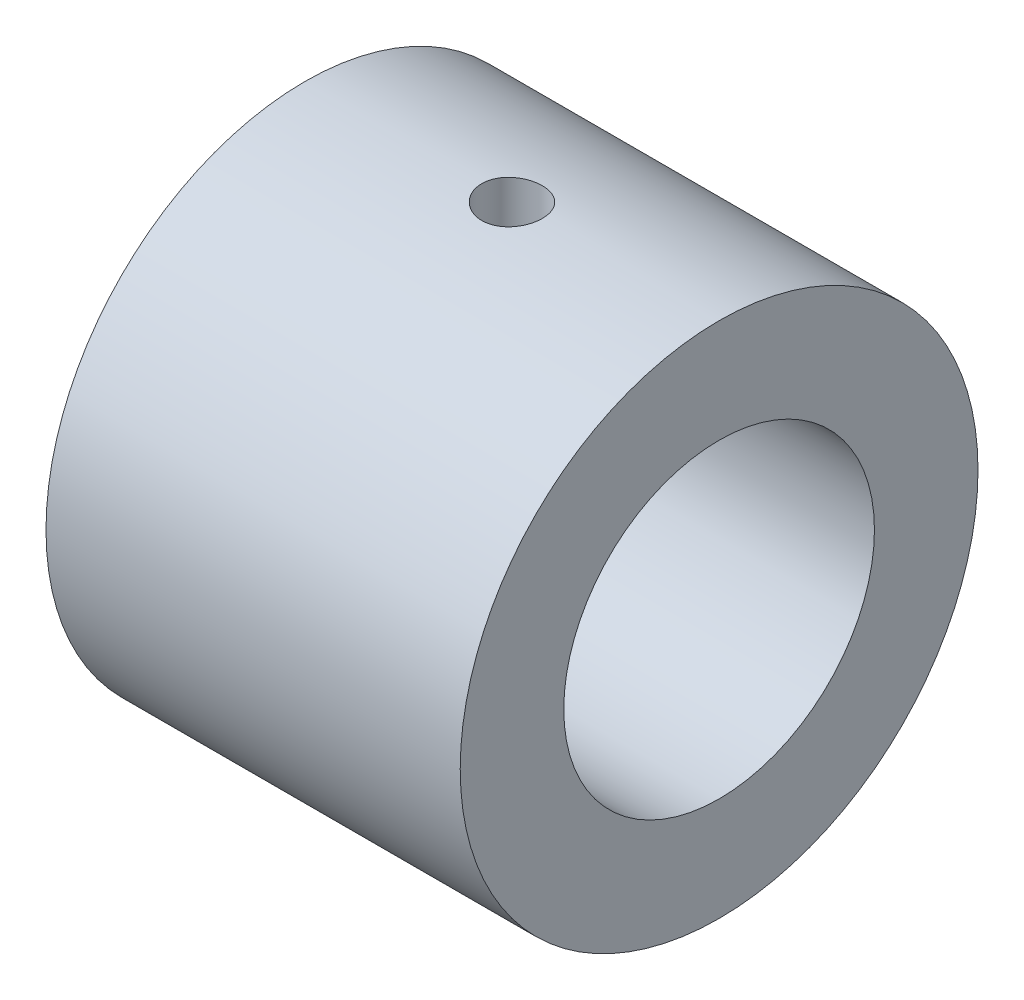
ISO-10303-21;
HEADER;
FILE_DESCRIPTION(('STEP AP214'),'2;1');
FILE_NAME('part.step','',(''),(''),'','','');
FILE_SCHEMA(('AUTOMOTIVE_DESIGN { 1 0 10303 214 1 1 1 1 }'));
ENDSEC;
DATA;
#1=APPLICATION_CONTEXT('core data for automotive mechanical design processes');
#2=APPLICATION_PROTOCOL_DEFINITION('international standard','automotive_design',2000,#1);
#3=PRODUCT_CONTEXT('',#1,'mechanical');
#4=PRODUCT('Part','Part','',(#3));
#5=PRODUCT_RELATED_PRODUCT_CATEGORY('part','',(#4));
#6=PRODUCT_DEFINITION_FORMATION('','',#4);
#7=PRODUCT_DEFINITION_CONTEXT('part definition',#1,'design');
#8=PRODUCT_DEFINITION('design','',#6,#7);
#9=PRODUCT_DEFINITION_SHAPE('','',#8);
#10=(LENGTH_UNIT() NAMED_UNIT(*) SI_UNIT(.MILLI.,.METRE.));
#11=(NAMED_UNIT(*) PLANE_ANGLE_UNIT() SI_UNIT($,.RADIAN.));
#12=(NAMED_UNIT(*) SI_UNIT($,.STERADIAN.) SOLID_ANGLE_UNIT());
#13=UNCERTAINTY_MEASURE_WITH_UNIT(LENGTH_MEASURE(1.E-05),#10,'distance_accuracy_value','');
#14=(GEOMETRIC_REPRESENTATION_CONTEXT(3) GLOBAL_UNCERTAINTY_ASSIGNED_CONTEXT((#13)) GLOBAL_UNIT_ASSIGNED_CONTEXT((#10,
#11,#12)) REPRESENTATION_CONTEXT('',''));
#15=CARTESIAN_POINT('',(0.,0.,0.));
#16=DIRECTION('',(0.,0.,1.));
#17=DIRECTION('',(1.,0.,0.));
#18=AXIS2_PLACEMENT_3D('',#15,#16,#17);
#19=CARTESIAN_POINT('',(12.7,0.,0.));
#20=DIRECTION('',(-1.,0.,0.));
#21=DIRECTION('',(0.,0.,1.));
#22=AXIS2_PLACEMENT_3D('',#19,#20,#21);
#23=CYLINDRICAL_SURFACE('',#22,15.875);
#24=CARTESIAN_POINT('',(12.7,0.,0.));
#25=DIRECTION('',(1.,0.,0.));
#26=DIRECTION('',(0.,0.,-1.));
#27=AXIS2_PLACEMENT_3D('',#24,#25,#26);
#28=CIRCLE('',#27,15.875);
#29=CARTESIAN_POINT('',(12.7,0.,-15.875));
#30=VERTEX_POINT('',#29);
#31=EDGE_CURVE('E10',#30,#30,#28,.T.);
#32=ORIENTED_EDGE('',*,*,#31,.F.);
#33=EDGE_LOOP('',(#32));
#34=FACE_BOUND('',#33,.T.);
#35=CARTESIAN_POINT('',(-12.7,0.,0.));
#36=DIRECTION('',(1.,0.,0.));
#37=DIRECTION('',(0.,0.,-1.));
#38=AXIS2_PLACEMENT_3D('',#35,#36,#37);
#39=CIRCLE('',#38,15.875);
#40=CARTESIAN_POINT('',(-12.7,0.,-15.875));
#41=VERTEX_POINT('',#40);
#42=EDGE_CURVE('E43',#41,#41,#39,.T.);
#43=ORIENTED_EDGE('',*,*,#42,.T.);
#44=EDGE_LOOP('',(#43));
#45=FACE_BOUND('',#44,.T.);
#46=CARTESIAN_POINT('',(-1.8542,15.875,0.));
#47=CARTESIAN_POINT('',(-1.85419555932185,15.874998631763,0.103772113420978));
#48=CARTESIAN_POINT('',(-1.84545908033716,15.8739717202227,0.207610400757321));
#49=CARTESIAN_POINT('',(-1.81074333877289,15.8699739323954,0.412401265358932));
#50=CARTESIAN_POINT('',(-1.78474572205156,15.8670009868958,0.513350651479264));
#51=CARTESIAN_POINT('',(-1.71628087069273,15.8594462871821,0.709369008328246));
#52=CARTESIAN_POINT('',(-1.67382432274471,15.8548655770627,0.804441748382639));
#53=CARTESIAN_POINT('',(-1.57366927911956,15.8446057770555,0.986093329569972));
#54=CARTESIAN_POINT('',(-1.51597354392246,15.838926886146,1.07267370514837));
#55=CARTESIAN_POINT('',(-1.38667929206726,15.8270748026109,1.23532050363793));
#56=CARTESIAN_POINT('',(-1.31502190271274,15.8208995842568,1.31133998337261));
#57=CARTESIAN_POINT('',(-1.15996462786278,15.8087673090001,1.45030304814464));
#58=CARTESIAN_POINT('',(-1.07656416444734,15.8028102628527,1.51324598925964));
#59=CARTESIAN_POINT('',(-0.900086679501025,15.7917686709833,1.62444138992893));
#60=CARTESIAN_POINT('',(-0.806982073266642,15.7866867277298,1.67265035062663));
#61=CARTESIAN_POINT('',(-0.613929397593727,15.7779970004705,1.75273154808747));
#62=CARTESIAN_POINT('',(-0.513981555667222,15.7743891674837,1.78460432766894));
#63=CARTESIAN_POINT('',(-0.310564238399129,15.7690752100479,1.83096686130618));
#64=CARTESIAN_POINT('',(-0.207112961360734,15.767360462962,1.84553545578099));
#65=CARTESIAN_POINT('',(0.000779361246091025,15.7660003318724,1.85711994345807));
#66=CARTESIAN_POINT('',(0.105220371756052,15.7663548748417,1.85413645608938));
#67=CARTESIAN_POINT('',(0.311580130138862,15.76908537705,1.83076627831062));
#68=CARTESIAN_POINT('',(0.413508834493849,15.7714512802414,1.81046616284189));
#69=CARTESIAN_POINT('',(0.612502812298134,15.7779222374003,1.75317392289465));
#70=CARTESIAN_POINT('',(0.709567998655037,15.7820273224993,1.71618149962086));
#71=CARTESIAN_POINT('',(0.896350168675297,15.7915255738385,1.62646078820364));
#72=CARTESIAN_POINT('',(0.986048783847023,15.7969218360148,1.57369460130978));
#73=CARTESIAN_POINT('',(1.15535041648712,15.8083919574438,1.45395135303841));
#74=CARTESIAN_POINT('',(1.23495303040241,15.814465843764,1.386973723893));
#75=CARTESIAN_POINT('',(1.38230574818052,15.8266515924289,1.24022772060829));
#76=CARTESIAN_POINT('',(1.44998150626218,15.8327634629701,1.16038467167295));
#77=CARTESIAN_POINT('',(1.57098150521025,15.8443021675659,0.990432159978753));
#78=CARTESIAN_POINT('',(1.62430571972549,15.8497290003627,0.900322678369914));
#79=CARTESIAN_POINT('',(1.71508793564019,15.859288950686,0.712339894826764));
#80=CARTESIAN_POINT('',(1.75254159311944,15.863421713933,0.614464475974573));
#81=CARTESIAN_POINT('',(1.81046210481525,15.869924545066,0.413754960034932));
#82=CARTESIAN_POINT('',(1.83092965285964,15.8722946849491,0.310921065666797));
#83=CARTESIAN_POINT('',(1.85420130883194,15.8749959028399,0.10385685576621));
#84=CARTESIAN_POINT('',(1.85710789338531,15.8753388104649,-0.000361794444553334));
#85=CARTESIAN_POINT('',(1.84544509987839,15.8739787902009,-0.207801343709549));
#86=CARTESIAN_POINT('',(1.83087604580439,15.8722759002395,-0.311022261225294));
#87=CARTESIAN_POINT('',(1.78476063161148,15.8670230520828,-0.513236230129026));
#88=CARTESIAN_POINT('',(1.75326282432113,15.863478377215,-0.612240503012021));
#89=CARTESIAN_POINT('',(1.67423428361494,15.8549390780681,-0.803561084478308));
#90=CARTESIAN_POINT('',(1.62670306950322,15.8499444103176,-0.895877192443618));
#91=CARTESIAN_POINT('',(1.51670683372761,15.8390330944465,-1.07166059884931));
#92=CARTESIAN_POINT('',(1.45417515654626,15.8331123734135,-1.15508593062613));
#93=CARTESIAN_POINT('',(1.31604778362486,15.8210248693648,-1.31029343608358));
#94=CARTESIAN_POINT('',(1.24045163721723,15.8148580778663,-1.38207520794618));
#95=CARTESIAN_POINT('',(1.07789129390653,15.8029372810048,-1.51231883423575));
#96=CARTESIAN_POINT('',(0.99087267462258,15.7971854701611,-1.5707129925055));
#97=CARTESIAN_POINT('',(0.808203126097955,15.7867810823237,-1.67205693816852));
#98=CARTESIAN_POINT('',(0.712552351116415,15.7821284856922,-1.71500700148391));
#99=CARTESIAN_POINT('',(0.51555691594539,15.774463879729,-1.7841326426781));
#100=CARTESIAN_POINT('',(0.41422606298999,15.7714480674968,-1.81034712917193));
#101=CARTESIAN_POINT('',(0.208563467170341,15.7673872987662,-1.84538313456473));
#102=CARTESIAN_POINT('',(0.104231845029156,15.7663422630943,-1.85420535217669));
#103=CARTESIAN_POINT('',(-0.103797472809784,15.7663434653472,-1.85419467499787));
#104=CARTESIAN_POINT('',(-0.207495190221066,15.7673771067279,-1.84546812374004));
#105=CARTESIAN_POINT('',(-0.411939792573641,15.7713921963936,-1.81083203654381));
#106=CARTESIAN_POINT('',(-0.512686676020666,15.774373645665,-1.78492249190428));
#107=CARTESIAN_POINT('',(-0.708360355988693,15.7819446645984,-1.71668780995018));
#108=CARTESIAN_POINT('',(-0.803288716182381,15.786533799964,-1.67436710557656));
#109=CARTESIAN_POINT('',(-0.984713022434303,15.7968038905535,-1.57452198805426));
#110=CARTESIAN_POINT('',(-1.07120891614071,15.8024848525552,-1.51699748052305));
#111=CARTESIAN_POINT('',(-1.23385728473446,15.8143397708865,-1.38798113129883));
#112=CARTESIAN_POINT('',(-1.30994665298222,15.8205164031923,-1.31640997385069));
#113=CARTESIAN_POINT('',(-1.44907765567795,15.8326427530419,-1.1614954771641));
#114=CARTESIAN_POINT('',(-1.5121161935603,15.8385924164603,-1.07814935195763));
#115=CARTESIAN_POINT('',(-1.62353143830718,15.8496160436626,-0.901735653509362));
#116=CARTESIAN_POINT('',(-1.67185848784579,15.8546870172344,-0.808636550385882));
#117=CARTESIAN_POINT('',(-1.75212564684536,15.8633510186036,-0.615639842802768));
#118=CARTESIAN_POINT('',(-1.78408379942711,15.8669456728493,-0.515749862023224));
#119=CARTESIAN_POINT('',(-1.82294313708644,15.8713724811037,-0.346104431164515));
#120=CARTESIAN_POINT('',(-1.83464791099947,15.8727262742911,-0.277424273278256));
#121=CARTESIAN_POINT('',(-1.85027780776738,15.8745404898417,-0.139172662826224));
#122=CARTESIAN_POINT('',(-1.85420297841672,15.8750009176932,-0.0696012157387822));
#123=CARTESIAN_POINT('',(-1.8542,15.875,0.));
#124=B_SPLINE_CURVE_WITH_KNOTS('',3,(#46,#47,#48,#49,#50,#51,#52,#53,#54,#55,#56,#57,#58,#59,
#60,#61,#62,#63,#64,#65,#66,#67,#68,#69,#70,#71,#72,#73,#74,#75,#76,#77,#78,#79,#80,#81,#82,#83,
#84,#85,#86,#87,#88,#89,#90,#91,#92,#93,#94,#95,#96,#97,#98,#99,#100,#101,#102,#103,#104,#105,
#106,#107,#108,#109,#110,#111,#112,#113,#114,#115,#116,#117,#118,#119,#120,#121,#122,#123),
.UNSPECIFIED.,.T.,.F.,(4,2,2,2,2,2,2,2,2,2,2,2,2,2,2,2,2,2,2,2,2,2,2,2,2,2,2,2,2,2,2,2,2,2,2,2,
2,2,4),(0.,0.311062135554928,0.622455561067637,0.933647138344782,1.24478238389754,
1.55725916709429,1.86975133380503,2.18315734673618,2.49655294514268,2.80851512184896,
3.1204662891906,3.43086692811097,3.74127312347844,4.05243119221574,4.36360169451445,
4.67664808676425,4.98969505380099,5.30282764946648,5.61594745404489,5.92723827608824,
6.23852332710357,6.5489203185791,6.85932661686133,7.17113864373006,7.48296142891071,
7.79632781984325,8.10968861193576,8.42231819125513,8.73493521080999,9.04566351580809,
9.35639197815287,9.66703656571144,9.97768308174209,10.2901369616096,10.6026648925412,
10.916236326478,11.2294613687495,11.4380957995455,11.6467289485795),.UNSPECIFIED.);
#125=CARTESIAN_POINT('',(-1.8542,15.875,0.));
#126=VERTEX_POINT('',#125);
#127=EDGE_CURVE('E53',#126,#126,#124,.T.);
#128=ORIENTED_EDGE('',*,*,#127,.F.);
#129=EDGE_LOOP('',(#128));
#130=FACE_BOUND('',#129,.T.);
#131=ADVANCED_FACE('F31',(#34,#45,#130),#23,.T.);
#132=CARTESIAN_POINT('',(-12.7,0.,0.));
#133=DIRECTION('',(1.,0.,0.));
#134=DIRECTION('',(0.,0.,-1.));
#135=AXIS2_PLACEMENT_3D('',#132,#133,#134);
#136=CYLINDRICAL_SURFACE('',#135,9.525);
#137=CARTESIAN_POINT('',(-12.7,0.,0.));
#138=DIRECTION('',(1.,0.,0.));
#139=DIRECTION('',(0.,0.,-1.));
#140=AXIS2_PLACEMENT_3D('',#137,#138,#139);
#141=CIRCLE('',#140,9.525);
#142=CARTESIAN_POINT('',(-12.7,0.,-9.525));
#143=VERTEX_POINT('',#142);
#144=EDGE_CURVE('E48',#143,#143,#141,.T.);
#145=ORIENTED_EDGE('',*,*,#144,.F.);
#146=EDGE_LOOP('',(#145));
#147=FACE_BOUND('',#146,.T.);
#148=CARTESIAN_POINT('',(12.7,0.,0.));
#149=DIRECTION('',(1.,0.,0.));
#150=DIRECTION('',(0.,0.,-1.));
#151=AXIS2_PLACEMENT_3D('',#148,#149,#150);
#152=CIRCLE('',#151,9.525);
#153=CARTESIAN_POINT('',(12.7,0.,-9.525));
#154=VERTEX_POINT('',#153);
#155=EDGE_CURVE('E50',#154,#154,#152,.T.);
#156=ORIENTED_EDGE('',*,*,#155,.T.);
#157=EDGE_LOOP('',(#156));
#158=FACE_BOUND('',#157,.T.);
#159=CARTESIAN_POINT('',(0.,9.34278156439505,-1.8542));
#160=CARTESIAN_POINT('',(0.103086924500128,9.3427835934464,-1.85419612493038));
#161=CARTESIAN_POINT('',(0.206223285850212,9.34450627463646,-1.84557391567735));
#162=CARTESIAN_POINT('',(0.409582458674765,9.35120141759212,-1.81133924542401));
#163=CARTESIAN_POINT('',(0.509802807419705,9.3561765475165,-1.78571283470286));
#164=CARTESIAN_POINT('',(0.70435829841208,9.36879225440518,-1.71829107265411));
#165=CARTESIAN_POINT('',(0.798699030584719,9.3764302526867,-1.67651135969765));
#166=CARTESIAN_POINT('',(0.979028045106529,9.39350802635211,-1.57801118654548));
#167=CARTESIAN_POINT('',(1.06501687341654,9.40294768384244,-1.52129170385787));
#168=CARTESIAN_POINT('',(1.22735910270541,9.42270651124062,-1.39371163174197));
#169=CARTESIAN_POINT('',(1.30358427375115,9.43303488839517,-1.32268927373394));
#170=CARTESIAN_POINT('',(1.44311693742101,9.45332624833162,-1.16886907731242));
#171=CARTESIAN_POINT('',(1.5064235498218,9.46328920617727,-1.08607043715797));
#172=CARTESIAN_POINT('',(1.61881695360418,9.48182618716639,-0.910201853165418));
#173=CARTESIAN_POINT('',(1.66778230138391,9.49038809168185,-0.81705291083931));
#174=CARTESIAN_POINT('',(1.74932010920573,9.50505500208632,-0.623655830024481));
#175=CARTESIAN_POINT('',(1.78189402241973,9.51116022576116,-0.523408321753664));
#176=CARTESIAN_POINT('',(1.82932627930691,9.52016084050325,-0.319989698111065));
#177=CARTESIAN_POINT('',(1.8444010003874,9.52309540459996,-0.21687079871769));
#178=CARTESIAN_POINT('',(1.85708165929187,9.52555922821966,-0.00952858391053082));
#179=CARTESIAN_POINT('',(1.85468919545967,9.52508879931833,0.0946946295809407));
#180=CARTESIAN_POINT('',(1.83266830770932,9.5208261079339,0.299801394876803));
#181=CARTESIAN_POINT('',(1.81327291812333,9.51707875914132,0.400711034782658));
#182=CARTESIAN_POINT('',(1.7581659068176,9.50673381147453,0.597815519602439));
#183=CARTESIAN_POINT('',(1.72245365700207,9.50013610288004,0.694010182861772));
#184=CARTESIAN_POINT('',(1.63550811368146,9.4847572791265,0.87962373146073));
#185=CARTESIAN_POINT('',(1.58418271756223,9.47596326451833,0.96899836143023));
#186=CARTESIAN_POINT('',(1.46753584723766,9.45716261694628,1.1379530764989));
#187=CARTESIAN_POINT('',(1.40221284350373,9.4471558515162,1.21753208972665));
#188=CARTESIAN_POINT('',(1.25814412761291,9.42684127883503,1.36601860242858));
#189=CARTESIAN_POINT('',(1.1791944985799,9.4165312293262,1.43472808930352));
#190=CARTESIAN_POINT('',(1.01079008764659,9.39692942879056,1.55796268524878));
#191=CARTESIAN_POINT('',(0.921335127392706,9.38763769505731,1.6124875534501));
#192=CARTESIAN_POINT('',(0.734184470889104,9.37112064866163,1.70586828250638));
#193=CARTESIAN_POINT('',(0.636473111418456,9.36389938325331,1.74469351439311));
#194=CARTESIAN_POINT('',(0.435741250020591,9.35240134897819,1.80531872838696));
#195=CARTESIAN_POINT('',(0.332721402197802,9.34812421826737,1.82712080274141));
#196=CARTESIAN_POINT('',(0.126087639447346,9.34307082861694,1.85278785075442));
#197=CARTESIAN_POINT('',(0.0225104880919577,9.3422388898963,1.85693813544196));
#198=CARTESIAN_POINT('',(-0.183856424573044,9.34402082103997,1.84795026353725));
#199=CARTESIAN_POINT('',(-0.286646227743154,9.34663450641568,1.83481303256828));
#200=CARTESIAN_POINT('',(-0.487570759083406,9.35496116710328,1.79186856948375));
#201=CARTESIAN_POINT('',(-0.585739073822179,9.36064601817171,1.76221253318824));
#202=CARTESIAN_POINT('',(-0.775713545459448,9.37444999669007,1.68723341156668));
#203=CARTESIAN_POINT('',(-0.867519201298148,9.38256931558695,1.64190909404165));
#204=CARTESIAN_POINT('',(-1.04341446062663,9.4004532172651,1.53622946509112));
#205=CARTESIAN_POINT('',(-1.12739437487984,9.41023693759495,1.47569488573866));
#206=CARTESIAN_POINT('',(-1.28410795781508,9.4302941839634,1.34155325025927));
#207=CARTESIAN_POINT('',(-1.35684053145906,9.44056775756674,1.26794492277281));
#208=CARTESIAN_POINT('',(-1.49006969138236,9.46062707366811,1.10846727270758));
#209=CARTESIAN_POINT('',(-1.55037381176109,9.47040359617536,1.02243581690981));
#210=CARTESIAN_POINT('',(-1.65567205823933,9.48820921079176,0.841297114489399));
#211=CARTESIAN_POINT('',(-1.70066680485876,9.49623837372017,0.74619023591215));
#212=CARTESIAN_POINT('',(-1.77378523659202,9.50960510850054,0.55011756817154));
#213=CARTESIAN_POINT('',(-1.80200117314934,9.51495737184203,0.449187226759812));
#214=CARTESIAN_POINT('',(-1.84105427965736,9.52243011894601,0.243905500372826));
#215=CARTESIAN_POINT('',(-1.8518934275155,9.52455097052155,0.139554506132262));
#216=CARTESIAN_POINT('',(-1.85581202508887,9.52531383495099,-0.0677648317213107));
#217=CARTESIAN_POINT('',(-1.84918140936863,9.52401264195726,-0.170727597208714));
#218=CARTESIAN_POINT('',(-1.81898662684285,9.51819642585428,-0.374041911963892));
#219=CARTESIAN_POINT('',(-1.79542265039732,9.51368143887359,-0.474393490572744));
#220=CARTESIAN_POINT('',(-1.7321560376183,9.50194583994532,-0.669468038211276));
#221=CARTESIAN_POINT('',(-1.69248651929755,9.49473078255183,-0.764202103187733));
#222=CARTESIAN_POINT('',(-1.59817070183028,9.47837371806643,-0.945711816682029));
#223=CARTESIAN_POINT('',(-1.54352329620409,9.46923156862364,-1.03248687660228));
#224=CARTESIAN_POINT('',(-1.41981623869058,9.4498500705873,-1.1970538425475));
#225=CARTESIAN_POINT('',(-1.35054826640599,9.43959603609785,-1.2746874397439));
#226=CARTESIAN_POINT('',(-1.19999624929598,9.41923602669601,-1.41732913409335));
#227=CARTESIAN_POINT('',(-1.11870937214008,9.40913008730182,-1.4823342468868));
#228=CARTESIAN_POINT('',(-0.94544283044216,9.39009843888629,-1.59849476145068));
#229=CARTESIAN_POINT('',(-0.853363432894644,9.38118568537043,-1.64950360317974));
#230=CARTESIAN_POINT('',(-0.661795189909095,9.36570672461736,-1.73524527043599));
#231=CARTESIAN_POINT('',(-0.562313283543813,9.35913835243795,-1.76999312161252));
#232=CARTESIAN_POINT('',(-0.385479940656549,9.35042846238925,-1.81534731601253));
#233=CARTESIAN_POINT('',(-0.30914898156345,9.34757832328976,-1.82989148383601));
#234=CARTESIAN_POINT('',(-0.15522133238159,9.34375413960684,-1.84931913415702));
#235=CARTESIAN_POINT('',(-0.0776246818424469,9.3427800365149,-1.85420291793598));
#236=CARTESIAN_POINT('',(0.,9.34278156439505,-1.8542));
#237=B_SPLINE_CURVE_WITH_KNOTS('',3,(#159,#160,#161,#162,#163,#164,#165,#166,#167,#168,#169,
#170,#171,#172,#173,#174,#175,#176,#177,#178,#179,#180,#181,#182,#183,#184,#185,#186,#187,#188,
#189,#190,#191,#192,#193,#194,#195,#196,#197,#198,#199,#200,#201,#202,#203,#204,#205,#206,#207,
#208,#209,#210,#211,#212,#213,#214,#215,#216,#217,#218,#219,#220,#221,#222,#223,#224,#225,#226,
#227,#228,#229,#230,#231,#232,#233,#234,#235,#236),.UNSPECIFIED.,.T.,.F.,(4,2,2,2,2,2,2,2,2,2,2,
2,2,2,2,2,2,2,2,2,2,2,2,2,2,2,2,2,2,2,2,2,2,2,2,2,2,2,4),(0.,0.308976619799246,
0.618207028360656,0.927138810702546,1.2360503846783,1.54867476946998,1.86132044823663,
2.17654179296357,2.49173518702233,2.80298824475737,3.11421282147706,3.42123743427744,
3.72827386657706,4.03715784758279,4.34607559778913,4.66009669830011,4.97412313085521,
5.28875928652759,5.60335676545495,5.91284951721225,6.22232569851233,6.52901473266112,
6.83572789121235,7.14624104372022,7.45678440869757,7.77182528463424,8.08685338980475,
8.40013303121033,8.71337701112812,9.02145515637338,9.32952983834619,9.63697420572328,
9.9444412914362,10.2566272382009,10.5688868711477,10.8843012899263,11.1994236778909,
11.4320910114371,11.6647510885999),.UNSPECIFIED.);
#238=CARTESIAN_POINT('',(0.,9.34278156439505,-1.8542));
#239=VERTEX_POINT('',#238);
#240=EDGE_CURVE('E35',#239,#239,#237,.T.);
#241=ORIENTED_EDGE('',*,*,#240,.F.);
#242=EDGE_LOOP('',(#241));
#243=FACE_BOUND('',#242,.T.);
#244=ADVANCED_FACE('F64',(#147,#158,#243),#136,.F.);
#245=CARTESIAN_POINT('',(12.7,0.,0.));
#246=DIRECTION('',(1.,0.,0.));
#247=DIRECTION('',(0.,0.,-1.));
#248=AXIS2_PLACEMENT_3D('',#245,#246,#247);
#249=PLANE('',#248);
#250=ORIENTED_EDGE('',*,*,#155,.F.);
#251=EDGE_LOOP('',(#250));
#252=FACE_BOUND('',#251,.T.);
#253=ORIENTED_EDGE('',*,*,#31,.T.);
#254=EDGE_LOOP('',(#253));
#255=FACE_BOUND('',#254,.T.);
#256=ADVANCED_FACE('F69',(#252,#255),#249,.T.);
#257=CARTESIAN_POINT('',(-12.7,0.,0.));
#258=DIRECTION('',(1.,0.,0.));
#259=DIRECTION('',(0.,0.,-1.));
#260=AXIS2_PLACEMENT_3D('',#257,#258,#259);
#261=PLANE('',#260);
#262=ORIENTED_EDGE('',*,*,#144,.T.);
#263=EDGE_LOOP('',(#262));
#264=FACE_BOUND('',#263,.T.);
#265=ORIENTED_EDGE('',*,*,#42,.F.);
#266=EDGE_LOOP('',(#265));
#267=FACE_BOUND('',#266,.T.);
#268=ADVANCED_FACE('F62',(#264,#267),#261,.F.);
#269=CARTESIAN_POINT('',(0.,15.875,0.));
#270=DIRECTION('',(0.,-1.,0.));
#271=DIRECTION('',(0.,0.,-1.));
#272=AXIS2_PLACEMENT_3D('',#269,#270,#271);
#273=CYLINDRICAL_SURFACE('',#272,1.8542);
#274=ORIENTED_EDGE('',*,*,#240,.T.);
#275=EDGE_LOOP('',(#274));
#276=FACE_BOUND('',#275,.T.);
#277=ORIENTED_EDGE('',*,*,#127,.T.);
#278=EDGE_LOOP('',(#277));
#279=FACE_BOUND('',#278,.T.);
#280=ADVANCED_FACE('F59',(#276,#279),#273,.F.);
#281=CLOSED_SHELL('',(#131,#244,#256,#268,#280));
#282=MANIFOLD_SOLID_BREP('B2',#281);
#283=ADVANCED_BREP_SHAPE_REPRESENTATION('',(#18,#282),#14);
#284=SHAPE_DEFINITION_REPRESENTATION(#9,#283);
ENDSEC;
END-ISO-10303-21;
